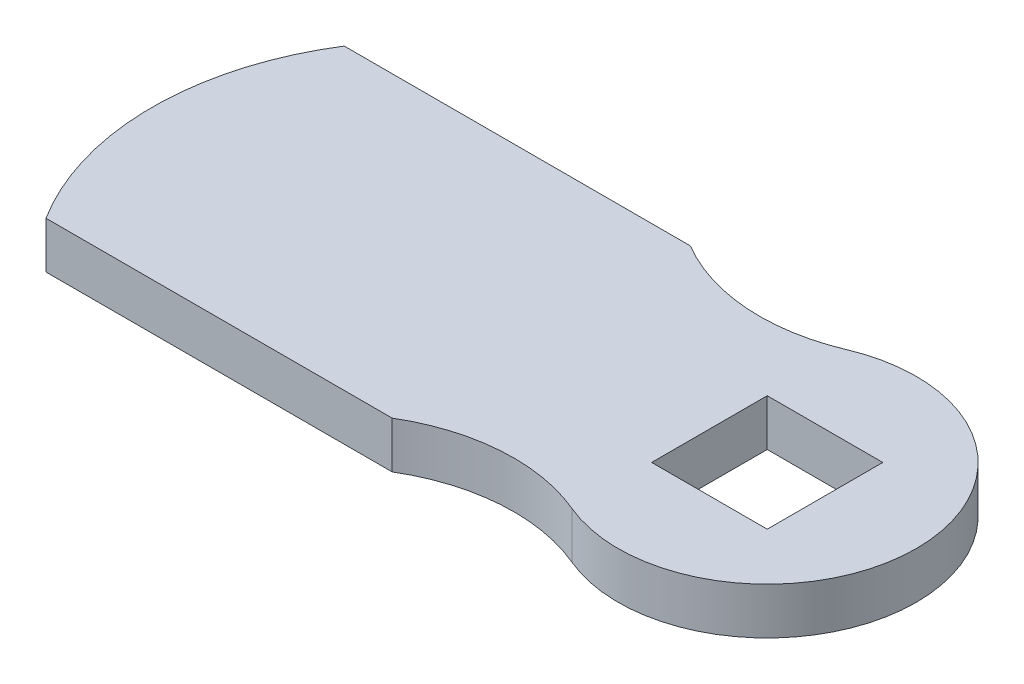
ISO-10303-21;
HEADER;
FILE_DESCRIPTION(('STEP AP214'),'2;1');
FILE_NAME('part.step','',(''),(''),'','','');
FILE_SCHEMA(('AUTOMOTIVE_DESIGN { 1 0 10303 214 1 1 1 1 }'));
ENDSEC;
DATA;
#1=APPLICATION_CONTEXT('core data for automotive mechanical design processes');
#2=APPLICATION_PROTOCOL_DEFINITION('international standard','automotive_design',2000,#1);
#3=PRODUCT_CONTEXT('',#1,'mechanical');
#4=PRODUCT('Part','Part','',(#3));
#5=PRODUCT_RELATED_PRODUCT_CATEGORY('part','',(#4));
#6=PRODUCT_DEFINITION_FORMATION('','',#4);
#7=PRODUCT_DEFINITION_CONTEXT('part definition',#1,'design');
#8=PRODUCT_DEFINITION('design','',#6,#7);
#9=PRODUCT_DEFINITION_SHAPE('','',#8);
#10=(LENGTH_UNIT() NAMED_UNIT(*) SI_UNIT(.MILLI.,.METRE.));
#11=(NAMED_UNIT(*) PLANE_ANGLE_UNIT() SI_UNIT($,.RADIAN.));
#12=(NAMED_UNIT(*) SI_UNIT($,.STERADIAN.) SOLID_ANGLE_UNIT());
#13=UNCERTAINTY_MEASURE_WITH_UNIT(LENGTH_MEASURE(1.E-05),#10,'distance_accuracy_value','');
#14=(GEOMETRIC_REPRESENTATION_CONTEXT(3) GLOBAL_UNCERTAINTY_ASSIGNED_CONTEXT((#13)) GLOBAL_UNIT_ASSIGNED_CONTEXT((#10,
#11,#12)) REPRESENTATION_CONTEXT('',''));
#15=CARTESIAN_POINT('',(0.,0.,0.));
#16=DIRECTION('',(0.,0.,1.));
#17=DIRECTION('',(1.,0.,0.));
#18=AXIS2_PLACEMENT_3D('',#15,#16,#17);
#19=CARTESIAN_POINT('',(-3.1,-0.300000000002802,-3.1));
#20=DIRECTION('',(1.,0.,0.));
#21=DIRECTION('',(0.,-1.,0.));
#22=AXIS2_PLACEMENT_3D('',#19,#20,#21);
#23=PLANE('',#22);
#24=DIRECTION('',(0.,0.,1.));
#25=VECTOR('',#24,1.);
#26=CARTESIAN_POINT('',(-3.1,-2.8000000000028,-3.1));
#27=LINE('',#26,#25);
#28=CARTESIAN_POINT('',(-3.1,-2.8000000000028,-3.1));
#29=VERTEX_POINT('',#28);
#30=CARTESIAN_POINT('',(-3.1,-2.8000000000028,3.1));
#31=VERTEX_POINT('',#30);
#32=EDGE_CURVE('E40',#29,#31,#27,.T.);
#33=ORIENTED_EDGE('',*,*,#32,.F.);
#34=DIRECTION('',(0.,-1.,0.));
#35=VECTOR('',#34,1.);
#36=CARTESIAN_POINT('',(-3.1,-0.300000000002802,-3.1));
#37=LINE('',#36,#35);
#38=CARTESIAN_POINT('',(-3.1,-0.300000000002802,-3.1));
#39=VERTEX_POINT('',#38);
#40=EDGE_CURVE('E137',#39,#29,#37,.T.);
#41=ORIENTED_EDGE('',*,*,#40,.F.);
#42=DIRECTION('',(0.,0.,-1.));
#43=VECTOR('',#42,1.);
#44=CARTESIAN_POINT('',(-3.1,-0.300000000002802,3.1));
#45=LINE('',#44,#43);
#46=CARTESIAN_POINT('',(-3.1,-0.300000000002802,3.1));
#47=VERTEX_POINT('',#46);
#48=EDGE_CURVE('E140',#47,#39,#45,.T.);
#49=ORIENTED_EDGE('',*,*,#48,.F.);
#50=DIRECTION('',(0.,-1.,0.));
#51=VECTOR('',#50,1.);
#52=CARTESIAN_POINT('',(-3.1,-0.300000000002802,3.1));
#53=LINE('',#52,#51);
#54=EDGE_CURVE('E11',#47,#31,#53,.T.);
#55=ORIENTED_EDGE('',*,*,#54,.T.);
#56=EDGE_LOOP('',(#33,#41,#49,#55));
#57=FACE_BOUND('',#56,.T.);
#58=ADVANCED_FACE('F17',(#57),#23,.T.);
#59=CARTESIAN_POINT('',(-3.1,-0.300000000002802,3.1));
#60=DIRECTION('',(0.,0.,-1.));
#61=DIRECTION('',(-1.,0.,0.));
#62=AXIS2_PLACEMENT_3D('',#59,#60,#61);
#63=PLANE('',#62);
#64=DIRECTION('',(1.,0.,0.));
#65=VECTOR('',#64,1.);
#66=CARTESIAN_POINT('',(-3.1,-2.8000000000028,3.1));
#67=LINE('',#66,#65);
#68=CARTESIAN_POINT('',(3.1,-2.8000000000028,3.1));
#69=VERTEX_POINT('',#68);
#70=EDGE_CURVE('E222',#31,#69,#67,.T.);
#71=ORIENTED_EDGE('',*,*,#70,.F.);
#72=ORIENTED_EDGE('',*,*,#54,.F.);
#73=DIRECTION('',(-1.,0.,0.));
#74=VECTOR('',#73,1.);
#75=CARTESIAN_POINT('',(3.1,-0.300000000002802,3.1));
#76=LINE('',#75,#74);
#77=CARTESIAN_POINT('',(3.1,-0.300000000002802,3.1));
#78=VERTEX_POINT('',#77);
#79=EDGE_CURVE('E129',#78,#47,#76,.T.);
#80=ORIENTED_EDGE('',*,*,#79,.F.);
#81=DIRECTION('',(0.,-1.,0.));
#82=VECTOR('',#81,1.);
#83=CARTESIAN_POINT('',(3.1,-0.300000000002802,3.1));
#84=LINE('',#83,#82);
#85=EDGE_CURVE('E28',#78,#69,#84,.T.);
#86=ORIENTED_EDGE('',*,*,#85,.T.);
#87=EDGE_LOOP('',(#71,#72,#80,#86));
#88=FACE_BOUND('',#87,.T.);
#89=ADVANCED_FACE('F275',(#88),#63,.T.);
#90=CARTESIAN_POINT('',(3.1,-0.300000000002802,3.1));
#91=DIRECTION('',(-1.,0.,0.));
#92=DIRECTION('',(0.,0.,-1.));
#93=AXIS2_PLACEMENT_3D('',#90,#91,#92);
#94=PLANE('',#93);
#95=DIRECTION('',(0.,0.,-1.));
#96=VECTOR('',#95,1.);
#97=CARTESIAN_POINT('',(3.1,-2.8000000000028,3.1));
#98=LINE('',#97,#96);
#99=CARTESIAN_POINT('',(3.1,-2.8000000000028,-3.1));
#100=VERTEX_POINT('',#99);
#101=EDGE_CURVE('E151',#69,#100,#98,.T.);
#102=ORIENTED_EDGE('',*,*,#101,.F.);
#103=ORIENTED_EDGE('',*,*,#85,.F.);
#104=DIRECTION('',(0.,0.,1.));
#105=VECTOR('',#104,1.);
#106=CARTESIAN_POINT('',(3.1,-0.300000000002802,-3.1));
#107=LINE('',#106,#105);
#108=CARTESIAN_POINT('',(3.1,-0.300000000002802,-3.1));
#109=VERTEX_POINT('',#108);
#110=EDGE_CURVE('E117',#109,#78,#107,.T.);
#111=ORIENTED_EDGE('',*,*,#110,.F.);
#112=DIRECTION('',(0.,-1.,0.));
#113=VECTOR('',#112,1.);
#114=CARTESIAN_POINT('',(3.1,-0.300000000002802,-3.1));
#115=LINE('',#114,#113);
#116=EDGE_CURVE('E121',#109,#100,#115,.T.);
#117=ORIENTED_EDGE('',*,*,#116,.T.);
#118=EDGE_LOOP('',(#102,#103,#111,#117));
#119=FACE_BOUND('',#118,.T.);
#120=ADVANCED_FACE('F120',(#119),#94,.T.);
#121=CARTESIAN_POINT('',(3.1,-0.300000000002802,-3.1));
#122=DIRECTION('',(0.,0.,1.));
#123=DIRECTION('',(0.,1.,0.));
#124=AXIS2_PLACEMENT_3D('',#121,#122,#123);
#125=PLANE('',#124);
#126=DIRECTION('',(-1.,0.,0.));
#127=VECTOR('',#126,1.);
#128=CARTESIAN_POINT('',(3.1,-2.8000000000028,-3.1));
#129=LINE('',#128,#127);
#130=EDGE_CURVE('E135',#100,#29,#129,.T.);
#131=ORIENTED_EDGE('',*,*,#130,.F.);
#132=ORIENTED_EDGE('',*,*,#116,.F.);
#133=DIRECTION('',(1.,0.,0.));
#134=VECTOR('',#133,1.);
#135=CARTESIAN_POINT('',(-3.1,-0.300000000002802,-3.1));
#136=LINE('',#135,#134);
#137=EDGE_CURVE('E128',#39,#109,#136,.T.);
#138=ORIENTED_EDGE('',*,*,#137,.F.);
#139=ORIENTED_EDGE('',*,*,#40,.T.);
#140=EDGE_LOOP('',(#131,#132,#138,#139));
#141=FACE_BOUND('',#140,.T.);
#142=ADVANCED_FACE('F133',(#141),#125,.T.);
#143=CARTESIAN_POINT('',(-30.6885775404495,-0.300000000002802,8.));
#144=DIRECTION('',(0.,0.,1.));
#145=DIRECTION('',(0.,1.,0.));
#146=AXIS2_PLACEMENT_3D('',#143,#144,#145);
#147=PLANE('',#146);
#148=DIRECTION('',(1.,0.,0.));
#149=VECTOR('',#148,1.);
#150=CARTESIAN_POINT('',(-30.6885775404495,-2.8000000000028,8.));
#151=LINE('',#150,#149);
#152=CARTESIAN_POINT('',(-30.6885775404495,-2.8000000000028,8.));
#153=VERTEX_POINT('',#152);
#154=CARTESIAN_POINT('',(-12.1229089415085,-2.8000000000028,8.));
#155=VERTEX_POINT('',#154);
#156=EDGE_CURVE('E152',#153,#155,#151,.T.);
#157=ORIENTED_EDGE('',*,*,#156,.T.);
#158=DIRECTION('',(0.,-1.,0.));
#159=VECTOR('',#158,1.);
#160=CARTESIAN_POINT('',(-12.1229089415085,-0.300000000002802,8.));
#161=LINE('',#160,#159);
#162=CARTESIAN_POINT('',(-12.1229089415085,-0.300000000002802,8.));
#163=VERTEX_POINT('',#162);
#164=EDGE_CURVE('E174',#163,#155,#161,.T.);
#165=ORIENTED_EDGE('',*,*,#164,.F.);
#166=DIRECTION('',(1.,0.,0.));
#167=VECTOR('',#166,1.);
#168=CARTESIAN_POINT('',(-30.6885775404495,-0.300000000002802,8.));
#169=LINE('',#168,#167);
#170=CARTESIAN_POINT('',(-30.6885775404495,-0.300000000002802,8.));
#171=VERTEX_POINT('',#170);
#172=EDGE_CURVE('E170',#171,#163,#169,.T.);
#173=ORIENTED_EDGE('',*,*,#172,.F.);
#174=DIRECTION('',(0.,-1.,0.));
#175=VECTOR('',#174,1.);
#176=CARTESIAN_POINT('',(-30.6885775404495,-0.300000000002802,8.));
#177=LINE('',#176,#175);
#178=EDGE_CURVE('E156',#171,#153,#177,.T.);
#179=ORIENTED_EDGE('',*,*,#178,.T.);
#180=EDGE_LOOP('',(#157,#165,#173,#179));
#181=FACE_BOUND('',#180,.T.);
#182=ADVANCED_FACE('F249',(#181),#147,.T.);
#183=CARTESIAN_POINT('',(-6.99509640303699,-1.5500000000028,16.5851929838702));
#184=DIRECTION('',(0.,-1.,0.));
#185=DIRECTION('',(-0.512781253847151,0.,-0.858519298387022));
#186=AXIS2_PLACEMENT_3D('',#183,#184,#185);
#187=CYLINDRICAL_SURFACE('',#186,10.);
#188=CARTESIAN_POINT('',(-6.99509640303699,-2.8000000000028,16.5851929838702));
#189=DIRECTION('',(0.,-1.,0.));
#190=DIRECTION('',(-0.512781253847148,0.,-0.858519298387023));
#191=AXIS2_PLACEMENT_3D('',#188,#189,#190);
#192=CIRCLE('',#191,10.);
#193=CARTESIAN_POINT('',(-3.10893173468311,-2.8000000000028,7.37119688172011));
#194=VERTEX_POINT('',#193);
#195=EDGE_CURVE('E171',#155,#194,#192,.T.);
#196=ORIENTED_EDGE('',*,*,#195,.T.);
#197=DIRECTION('',(0.,-1.,0.));
#198=VECTOR('',#197,1.);
#199=CARTESIAN_POINT('',(-3.10893173468311,-0.300000000002802,7.37119688172011));
#200=LINE('',#199,#198);
#201=CARTESIAN_POINT('',(-3.10893173468311,-0.300000000002802,7.37119688172011));
#202=VERTEX_POINT('',#201);
#203=EDGE_CURVE('E192',#202,#194,#200,.T.);
#204=ORIENTED_EDGE('',*,*,#203,.F.);
#205=CARTESIAN_POINT('',(-6.99509640303699,-0.300000000002802,16.5851929838702));
#206=DIRECTION('',(0.,-1.,0.));
#207=DIRECTION('',(-0.512781253847148,0.,-0.858519298387023));
#208=AXIS2_PLACEMENT_3D('',#205,#206,#207);
#209=CIRCLE('',#208,10.);
#210=EDGE_CURVE('E167',#163,#202,#209,.T.);
#211=ORIENTED_EDGE('',*,*,#210,.F.);
#212=ORIENTED_EDGE('',*,*,#164,.T.);
#213=EDGE_LOOP('',(#196,#204,#211,#212));
#214=FACE_BOUND('',#213,.T.);
#215=ADVANCED_FACE('F255',(#214),#187,.F.);
#216=CARTESIAN_POINT('',(0.,-0.300000000002802,0.));
#217=DIRECTION('',(0.,-1.,0.));
#218=DIRECTION('',(0.388616466835391,0.,0.921399610215013));
#219=AXIS2_PLACEMENT_3D('',#216,#217,#218);
#220=CYLINDRICAL_SURFACE('',#219,8.);
#221=CARTESIAN_POINT('',(0.,-2.8000000000028,0.));
#222=DIRECTION('',(0.,1.,0.));
#223=DIRECTION('',(0.388616466835391,0.,0.921399610215013));
#224=AXIS2_PLACEMENT_3D('',#221,#222,#223);
#225=CIRCLE('',#224,8.);
#226=CARTESIAN_POINT('',(-3.10893173468313,-2.8000000000028,-7.37119688172011));
#227=VERTEX_POINT('',#226);
#228=EDGE_CURVE('E188',#194,#227,#225,.T.);
#229=ORIENTED_EDGE('',*,*,#228,.T.);
#230=DIRECTION('',(0.,-1.,0.));
#231=VECTOR('',#230,1.);
#232=CARTESIAN_POINT('',(-3.10893173468313,-0.300000000002802,-7.37119688172011));
#233=LINE('',#232,#231);
#234=CARTESIAN_POINT('',(-3.10893173468313,-0.300000000002802,-7.37119688172011));
#235=VERTEX_POINT('',#234);
#236=EDGE_CURVE('E21',#235,#227,#233,.T.);
#237=ORIENTED_EDGE('',*,*,#236,.F.);
#238=CARTESIAN_POINT('',(0.,-0.300000000002802,0.));
#239=DIRECTION('',(0.,1.,0.));
#240=DIRECTION('',(0.388616466835391,0.,0.921399610215013));
#241=AXIS2_PLACEMENT_3D('',#238,#239,#240);
#242=CIRCLE('',#241,8.);
#243=EDGE_CURVE('E160',#202,#235,#242,.T.);
#244=ORIENTED_EDGE('',*,*,#243,.F.);
#245=ORIENTED_EDGE('',*,*,#203,.T.);
#246=EDGE_LOOP('',(#229,#237,#244,#245));
#247=FACE_BOUND('',#246,.T.);
#248=ADVANCED_FACE('F19',(#247),#220,.T.);
#249=CARTESIAN_POINT('',(-6.99509640303703,-1.5500000000028,-16.5851929838702));
#250=DIRECTION('',(0.,-1.,0.));
#251=DIRECTION('',(0.388616466835392,0.,0.921399610215012));
#252=AXIS2_PLACEMENT_3D('',#249,#250,#251);
#253=CYLINDRICAL_SURFACE('',#252,10.);
#254=CARTESIAN_POINT('',(-6.99509640303703,-2.8000000000028,-16.5851929838702));
#255=DIRECTION('',(0.,-1.,0.));
#256=DIRECTION('',(0.388616466835391,0.,0.921399610215013));
#257=AXIS2_PLACEMENT_3D('',#254,#255,#256);
#258=CIRCLE('',#257,10.);
#259=CARTESIAN_POINT('',(-12.1229089415085,-2.8000000000028,-8.));
#260=VERTEX_POINT('',#259);
#261=EDGE_CURVE('E200',#227,#260,#258,.T.);
#262=ORIENTED_EDGE('',*,*,#261,.T.);
#263=DIRECTION('',(0.,-1.,0.));
#264=VECTOR('',#263,1.);
#265=CARTESIAN_POINT('',(-12.1229089415085,-0.300000000002802,-8.));
#266=LINE('',#265,#264);
#267=CARTESIAN_POINT('',(-12.1229089415085,-0.300000000002802,-8.));
#268=VERTEX_POINT('',#267);
#269=EDGE_CURVE('E165',#268,#260,#266,.T.);
#270=ORIENTED_EDGE('',*,*,#269,.F.);
#271=CARTESIAN_POINT('',(-6.99509640303703,-0.300000000002802,-16.5851929838702));
#272=DIRECTION('',(0.,-1.,0.));
#273=DIRECTION('',(0.388616466835391,0.,0.921399610215013));
#274=AXIS2_PLACEMENT_3D('',#271,#272,#273);
#275=CIRCLE('',#274,10.);
#276=EDGE_CURVE('E157',#235,#268,#275,.T.);
#277=ORIENTED_EDGE('',*,*,#276,.F.);
#278=ORIENTED_EDGE('',*,*,#236,.T.);
#279=EDGE_LOOP('',(#262,#270,#277,#278));
#280=FACE_BOUND('',#279,.T.);
#281=ADVANCED_FACE('F261',(#280),#253,.F.);
#282=CARTESIAN_POINT('',(-12.1229089415085,-0.300000000002802,-8.));
#283=DIRECTION('',(0.,0.,-1.));
#284=DIRECTION('',(-1.,0.,0.));
#285=AXIS2_PLACEMENT_3D('',#282,#283,#284);
#286=PLANE('',#285);
#287=DIRECTION('',(-1.,0.,0.));
#288=VECTOR('',#287,1.);
#289=CARTESIAN_POINT('',(-12.1229089415085,-2.8000000000028,-8.));
#290=LINE('',#289,#288);
#291=CARTESIAN_POINT('',(-30.6885775404495,-2.8000000000028,-8.));
#292=VERTEX_POINT('',#291);
#293=EDGE_CURVE('E216',#260,#292,#290,.T.);
#294=ORIENTED_EDGE('',*,*,#293,.T.);
#295=DIRECTION('',(0.,-1.,0.));
#296=VECTOR('',#295,1.);
#297=CARTESIAN_POINT('',(-30.6885775404495,-0.300000000002802,-8.));
#298=LINE('',#297,#296);
#299=CARTESIAN_POINT('',(-30.6885775404495,-0.300000000002802,-8.));
#300=VERTEX_POINT('',#299);
#301=EDGE_CURVE('E166',#300,#292,#298,.T.);
#302=ORIENTED_EDGE('',*,*,#301,.F.);
#303=DIRECTION('',(-1.,0.,0.));
#304=VECTOR('',#303,1.);
#305=CARTESIAN_POINT('',(-12.1229089415085,-0.300000000002802,-8.));
#306=LINE('',#305,#304);
#307=EDGE_CURVE('E147',#268,#300,#306,.T.);
#308=ORIENTED_EDGE('',*,*,#307,.F.);
#309=ORIENTED_EDGE('',*,*,#269,.T.);
#310=EDGE_LOOP('',(#294,#302,#308,#309));
#311=FACE_BOUND('',#310,.T.);
#312=ADVANCED_FACE('F263',(#311),#286,.T.);
#313=CARTESIAN_POINT('',(-18.,-0.300000000002802,0.));
#314=DIRECTION('',(0.,-1.,0.));
#315=DIRECTION('',(0.845905169363301,0.,-0.533333333333334));
#316=AXIS2_PLACEMENT_3D('',#313,#314,#315);
#317=CYLINDRICAL_SURFACE('',#316,15.);
#318=CARTESIAN_POINT('',(-18.,-2.8000000000028,0.));
#319=DIRECTION('',(0.,1.,0.));
#320=DIRECTION('',(0.845905169363301,0.,-0.533333333333334));
#321=AXIS2_PLACEMENT_3D('',#318,#319,#320);
#322=CIRCLE('',#321,15.);
#323=EDGE_CURVE('E161',#292,#153,#322,.T.);
#324=ORIENTED_EDGE('',*,*,#323,.T.);
#325=ORIENTED_EDGE('',*,*,#178,.F.);
#326=CARTESIAN_POINT('',(-18.,-0.300000000002802,0.));
#327=DIRECTION('',(0.,1.,0.));
#328=DIRECTION('',(0.845905169363301,0.,-0.533333333333334));
#329=AXIS2_PLACEMENT_3D('',#326,#327,#328);
#330=CIRCLE('',#329,15.);
#331=EDGE_CURVE('E182',#300,#171,#330,.T.);
#332=ORIENTED_EDGE('',*,*,#331,.F.);
#333=ORIENTED_EDGE('',*,*,#301,.T.);
#334=EDGE_LOOP('',(#324,#325,#332,#333));
#335=FACE_BOUND('',#334,.T.);
#336=ADVANCED_FACE('F245',(#335),#317,.T.);
#337=CARTESIAN_POINT('',(-13.2602345862068,-2.8000000000028,0.));
#338=DIRECTION('',(0.,-1.,0.));
#339=DIRECTION('',(-1.,0.,0.));
#340=AXIS2_PLACEMENT_3D('',#337,#338,#339);
#341=PLANE('',#340);
#342=ORIENTED_EDGE('',*,*,#156,.F.);
#343=ORIENTED_EDGE('',*,*,#323,.F.);
#344=ORIENTED_EDGE('',*,*,#293,.F.);
#345=ORIENTED_EDGE('',*,*,#261,.F.);
#346=ORIENTED_EDGE('',*,*,#228,.F.);
#347=ORIENTED_EDGE('',*,*,#195,.F.);
#348=EDGE_LOOP('',(#342,#343,#344,#345,#346,#347));
#349=FACE_BOUND('',#348,.T.);
#350=ORIENTED_EDGE('',*,*,#32,.T.);
#351=ORIENTED_EDGE('',*,*,#70,.T.);
#352=ORIENTED_EDGE('',*,*,#101,.T.);
#353=ORIENTED_EDGE('',*,*,#130,.T.);
#354=EDGE_LOOP('',(#350,#351,#352,#353));
#355=FACE_BOUND('',#354,.T.);
#356=ADVANCED_FACE('F252',(#349,#355),#341,.T.);
#357=CARTESIAN_POINT('',(-13.2602345862068,-0.300000000002802,0.));
#358=DIRECTION('',(0.,1.,0.));
#359=DIRECTION('',(0.,0.,1.));
#360=AXIS2_PLACEMENT_3D('',#357,#358,#359);
#361=PLANE('',#360);
#362=ORIENTED_EDGE('',*,*,#331,.T.);
#363=ORIENTED_EDGE('',*,*,#172,.T.);
#364=ORIENTED_EDGE('',*,*,#210,.T.);
#365=ORIENTED_EDGE('',*,*,#243,.T.);
#366=ORIENTED_EDGE('',*,*,#276,.T.);
#367=ORIENTED_EDGE('',*,*,#307,.T.);
#368=EDGE_LOOP('',(#362,#363,#364,#365,#366,#367));
#369=FACE_BOUND('',#368,.T.);
#370=ORIENTED_EDGE('',*,*,#48,.T.);
#371=ORIENTED_EDGE('',*,*,#137,.T.);
#372=ORIENTED_EDGE('',*,*,#110,.T.);
#373=ORIENTED_EDGE('',*,*,#79,.T.);
#374=EDGE_LOOP('',(#370,#371,#372,#373));
#375=FACE_BOUND('',#374,.T.);
#376=ADVANCED_FACE('F139',(#369,#375),#361,.T.);
#377=CLOSED_SHELL('',(#58,#89,#120,#142,#182,#215,#248,#281,#312,#336,#356,#376));
#378=MANIFOLD_SOLID_BREP('B1',#377);
#379=ADVANCED_BREP_SHAPE_REPRESENTATION('',(#18,#378),#14);
#380=SHAPE_DEFINITION_REPRESENTATION(#9,#379);
ENDSEC;
END-ISO-10303-21;
